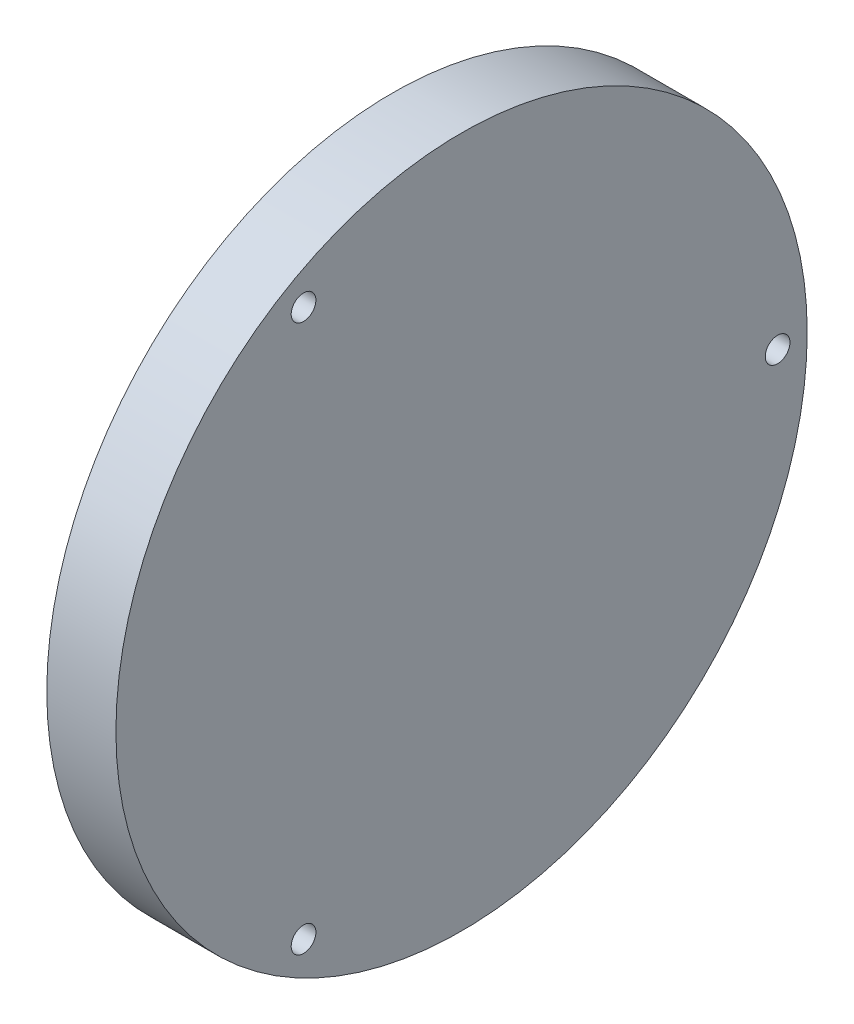
ISO-10303-21;
HEADER;
FILE_DESCRIPTION(('STEP AP214'),'2;1');
FILE_NAME('part.step','',(''),(''),'','','');
FILE_SCHEMA(('AUTOMOTIVE_DESIGN { 1 0 10303 214 1 1 1 1 }'));
ENDSEC;
DATA;
#1=APPLICATION_CONTEXT('core data for automotive mechanical design processes');
#2=APPLICATION_PROTOCOL_DEFINITION('international standard','automotive_design',2000,#1);
#3=PRODUCT_CONTEXT('',#1,'mechanical');
#4=PRODUCT('Part','Part','',(#3));
#5=PRODUCT_RELATED_PRODUCT_CATEGORY('part','',(#4));
#6=PRODUCT_DEFINITION_FORMATION('','',#4);
#7=PRODUCT_DEFINITION_CONTEXT('part definition',#1,'design');
#8=PRODUCT_DEFINITION('design','',#6,#7);
#9=PRODUCT_DEFINITION_SHAPE('','',#8);
#10=(LENGTH_UNIT() NAMED_UNIT(*) SI_UNIT(.MILLI.,.METRE.));
#11=(NAMED_UNIT(*) PLANE_ANGLE_UNIT() SI_UNIT($,.RADIAN.));
#12=(NAMED_UNIT(*) SI_UNIT($,.STERADIAN.) SOLID_ANGLE_UNIT());
#13=UNCERTAINTY_MEASURE_WITH_UNIT(LENGTH_MEASURE(1.E-05),#10,'distance_accuracy_value','');
#14=(GEOMETRIC_REPRESENTATION_CONTEXT(3) GLOBAL_UNCERTAINTY_ASSIGNED_CONTEXT((#13)) GLOBAL_UNIT_ASSIGNED_CONTEXT((#10,
#11,#12)) REPRESENTATION_CONTEXT('',''));
#15=CARTESIAN_POINT('',(0.,0.,0.));
#16=DIRECTION('',(0.,0.,1.));
#17=DIRECTION('',(1.,0.,0.));
#18=AXIS2_PLACEMENT_3D('',#15,#16,#17);
#19=CARTESIAN_POINT('',(0.,35.,0.));
#20=DIRECTION('',(1.,0.,0.));
#21=DIRECTION('',(0.,0.,-1.));
#22=AXIS2_PLACEMENT_3D('',#19,#20,#21);
#23=PLANE('',#22);
#24=CARTESIAN_POINT('',(0.,15.5884572681199,9.));
#25=DIRECTION('',(1.,0.,0.));
#26=DIRECTION('',(0.,0.,-1.));
#27=AXIS2_PLACEMENT_3D('',#24,#25,#26);
#28=CIRCLE('',#27,7.);
#29=CARTESIAN_POINT('',(0.,9.52627944162882,5.5));
#30=VERTEX_POINT('',#29);
#31=CARTESIAN_POINT('',(0.,21.650635094611,12.5));
#32=VERTEX_POINT('',#31);
#33=EDGE_CURVE('E48',#30,#32,#28,.T.);
#34=ORIENTED_EDGE('',*,*,#33,.T.);
#35=CARTESIAN_POINT('',(0.,0.,0.));
#36=DIRECTION('',(1.,0.,0.));
#37=DIRECTION('',(0.,0.,-1.));
#38=AXIS2_PLACEMENT_3D('',#35,#36,#37);
#39=CIRCLE('',#38,25.);
#40=CARTESIAN_POINT('',(0.,21.650635094611,-12.5));
#41=VERTEX_POINT('',#40);
#42=EDGE_CURVE('E103',#32,#41,#39,.T.);
#43=ORIENTED_EDGE('',*,*,#42,.T.);
#44=CARTESIAN_POINT('',(0.,15.5884572681199,-9.00000000000001));
#45=DIRECTION('',(1.,0.,0.));
#46=DIRECTION('',(0.,0.,-1.));
#47=AXIS2_PLACEMENT_3D('',#44,#45,#46);
#48=CIRCLE('',#47,7.);
#49=CARTESIAN_POINT('',(0.,9.52627944162882,-5.50000000000001));
#50=VERTEX_POINT('',#49);
#51=EDGE_CURVE('E93',#41,#50,#48,.T.);
#52=ORIENTED_EDGE('',*,*,#51,.T.);
#53=CARTESIAN_POINT('',(0.,0.,0.));
#54=DIRECTION('',(-1.,0.,0.));
#55=DIRECTION('',(0.,0.,1.));
#56=AXIS2_PLACEMENT_3D('',#53,#54,#55);
#57=CIRCLE('',#56,11.);
#58=EDGE_CURVE('E107',#50,#30,#57,.T.);
#59=ORIENTED_EDGE('',*,*,#58,.T.);
#60=EDGE_LOOP('',(#34,#43,#52,#59));
#61=FACE_BOUND('',#60,.T.);
#62=CARTESIAN_POINT('',(0.,0.,0.));
#63=DIRECTION('',(1.,0.,0.));
#64=DIRECTION('',(0.,0.,-1.));
#65=AXIS2_PLACEMENT_3D('',#62,#63,#64);
#66=CIRCLE('',#65,9.3);
#67=CARTESIAN_POINT('',(0.,0.,-9.3));
#68=VERTEX_POINT('',#67);
#69=EDGE_CURVE('E198',#68,#68,#66,.T.);
#70=ORIENTED_EDGE('',*,*,#69,.T.);
#71=EDGE_LOOP('',(#70));
#72=FACE_BOUND('',#71,.T.);
#73=CARTESIAN_POINT('',(0.,0.,0.));
#74=DIRECTION('',(1.,0.,0.));
#75=DIRECTION('',(0.,0.,-1.));
#76=AXIS2_PLACEMENT_3D('',#73,#74,#75);
#77=CIRCLE('',#76,26.7);
#78=CARTESIAN_POINT('',(0.,0.,-26.7));
#79=VERTEX_POINT('',#78);
#80=EDGE_CURVE('E191',#79,#79,#77,.T.);
#81=ORIENTED_EDGE('',*,*,#80,.F.);
#82=EDGE_LOOP('',(#81));
#83=FACE_BOUND('',#82,.T.);
#84=ADVANCED_FACE('F33',(#61,#72,#83),#23,.F.);
#85=CARTESIAN_POINT('',(3.,15.5884572681199,9.));
#86=DIRECTION('',(-1.,0.,0.));
#87=DIRECTION('',(0.,0.,1.));
#88=AXIS2_PLACEMENT_3D('',#85,#86,#87);
#89=CYLINDRICAL_SURFACE('',#88,7.);
#90=ORIENTED_EDGE('',*,*,#33,.F.);
#91=DIRECTION('',(-1.,0.,0.));
#92=VECTOR('',#91,1.);
#93=CARTESIAN_POINT('',(3.,9.52627944162882,5.5));
#94=LINE('',#93,#92);
#95=CARTESIAN_POINT('',(3.,9.52627944162882,5.5));
#96=VERTEX_POINT('',#95);
#97=EDGE_CURVE('E98',#96,#30,#94,.T.);
#98=ORIENTED_EDGE('',*,*,#97,.F.);
#99=CARTESIAN_POINT('',(3.,15.5884572681199,9.));
#100=DIRECTION('',(1.,0.,0.));
#101=DIRECTION('',(0.,0.,-1.));
#102=AXIS2_PLACEMENT_3D('',#99,#100,#101);
#103=CIRCLE('',#102,7.);
#104=CARTESIAN_POINT('',(3.,21.650635094611,12.5));
#105=VERTEX_POINT('',#104);
#106=EDGE_CURVE('E89',#96,#105,#103,.T.);
#107=ORIENTED_EDGE('',*,*,#106,.T.);
#108=DIRECTION('',(-1.,0.,0.));
#109=VECTOR('',#108,1.);
#110=CARTESIAN_POINT('',(3.,21.650635094611,12.5));
#111=LINE('',#110,#109);
#112=EDGE_CURVE('E87',#105,#32,#111,.T.);
#113=ORIENTED_EDGE('',*,*,#112,.T.);
#114=EDGE_LOOP('',(#90,#98,#107,#113));
#115=FACE_BOUND('',#114,.T.);
#116=ADVANCED_FACE('F135',(#115),#89,.F.);
#117=CARTESIAN_POINT('',(3.,0.,0.));
#118=DIRECTION('',(-1.,0.,0.));
#119=DIRECTION('',(0.,0.,1.));
#120=AXIS2_PLACEMENT_3D('',#117,#118,#119);
#121=CYLINDRICAL_SURFACE('',#120,25.);
#122=ORIENTED_EDGE('',*,*,#42,.F.);
#123=ORIENTED_EDGE('',*,*,#112,.F.);
#124=CARTESIAN_POINT('',(3.,0.,0.));
#125=DIRECTION('',(1.,0.,0.));
#126=DIRECTION('',(0.,0.,-1.));
#127=AXIS2_PLACEMENT_3D('',#124,#125,#126);
#128=CIRCLE('',#127,25.);
#129=CARTESIAN_POINT('',(3.,21.650635094611,-12.5));
#130=VERTEX_POINT('',#129);
#131=EDGE_CURVE('E80',#105,#130,#128,.T.);
#132=ORIENTED_EDGE('',*,*,#131,.T.);
#133=DIRECTION('',(-1.,0.,0.));
#134=VECTOR('',#133,1.);
#135=CARTESIAN_POINT('',(3.,21.650635094611,-12.5));
#136=LINE('',#135,#134);
#137=EDGE_CURVE('E86',#130,#41,#136,.T.);
#138=ORIENTED_EDGE('',*,*,#137,.T.);
#139=EDGE_LOOP('',(#122,#123,#132,#138));
#140=FACE_BOUND('',#139,.T.);
#141=ADVANCED_FACE('F85',(#140),#121,.F.);
#142=CARTESIAN_POINT('',(3.,15.5884572681199,-9.00000000000001));
#143=DIRECTION('',(-1.,0.,0.));
#144=DIRECTION('',(0.,0.,1.));
#145=AXIS2_PLACEMENT_3D('',#142,#143,#144);
#146=CYLINDRICAL_SURFACE('',#145,7.);
#147=ORIENTED_EDGE('',*,*,#51,.F.);
#148=ORIENTED_EDGE('',*,*,#137,.F.);
#149=CARTESIAN_POINT('',(3.,15.5884572681199,-9.00000000000001));
#150=DIRECTION('',(1.,0.,0.));
#151=DIRECTION('',(0.,0.,-1.));
#152=AXIS2_PLACEMENT_3D('',#149,#150,#151);
#153=CIRCLE('',#152,7.);
#154=CARTESIAN_POINT('',(3.,9.52627944162882,-5.50000000000001));
#155=VERTEX_POINT('',#154);
#156=EDGE_CURVE('E88',#130,#155,#153,.T.);
#157=ORIENTED_EDGE('',*,*,#156,.T.);
#158=DIRECTION('',(-1.,0.,0.));
#159=VECTOR('',#158,1.);
#160=CARTESIAN_POINT('',(3.,9.52627944162882,-5.50000000000001));
#161=LINE('',#160,#159);
#162=EDGE_CURVE('E72',#155,#50,#161,.T.);
#163=ORIENTED_EDGE('',*,*,#162,.T.);
#164=EDGE_LOOP('',(#147,#148,#157,#163));
#165=FACE_BOUND('',#164,.T.);
#166=ADVANCED_FACE('F91',(#165),#146,.F.);
#167=CARTESIAN_POINT('',(3.,0.,0.));
#168=DIRECTION('',(-1.,0.,0.));
#169=DIRECTION('',(0.,0.,1.));
#170=AXIS2_PLACEMENT_3D('',#167,#168,#169);
#171=CYLINDRICAL_SURFACE('',#170,11.);
#172=ORIENTED_EDGE('',*,*,#58,.F.);
#173=ORIENTED_EDGE('',*,*,#162,.F.);
#174=CARTESIAN_POINT('',(3.,0.,0.));
#175=DIRECTION('',(-1.,0.,0.));
#176=DIRECTION('',(0.,0.,1.));
#177=AXIS2_PLACEMENT_3D('',#174,#175,#176);
#178=CIRCLE('',#177,11.);
#179=EDGE_CURVE('E56',#155,#96,#178,.T.);
#180=ORIENTED_EDGE('',*,*,#179,.T.);
#181=ORIENTED_EDGE('',*,*,#97,.T.);
#182=EDGE_LOOP('',(#172,#173,#180,#181));
#183=FACE_BOUND('',#182,.T.);
#184=ADVANCED_FACE('F204',(#183),#171,.T.);
#185=CARTESIAN_POINT('',(3.,7.79422863405995,4.5));
#186=DIRECTION('',(1.,0.,0.));
#187=DIRECTION('',(0.,0.,-1.));
#188=AXIS2_PLACEMENT_3D('',#185,#186,#187);
#189=PLANE('',#188);
#190=ORIENTED_EDGE('',*,*,#106,.F.);
#191=ORIENTED_EDGE('',*,*,#179,.F.);
#192=ORIENTED_EDGE('',*,*,#156,.F.);
#193=ORIENTED_EDGE('',*,*,#131,.F.);
#194=EDGE_LOOP('',(#190,#191,#192,#193));
#195=FACE_BOUND('',#194,.T.);
#196=ADVANCED_FACE('F96',(#195),#189,.F.);
#197=CARTESIAN_POINT('',(1.5,0.,0.));
#198=DIRECTION('',(1.,0.,0.));
#199=DIRECTION('',(0.,0.,-1.));
#200=AXIS2_PLACEMENT_3D('',#197,#198,#199);
#201=PLANE('',#200);
#202=CARTESIAN_POINT('',(1.5,0.,0.));
#203=DIRECTION('',(1.,0.,0.));
#204=DIRECTION('',(0.,0.,-1.));
#205=AXIS2_PLACEMENT_3D('',#202,#203,#204);
#206=CIRCLE('',#205,9.3);
#207=CARTESIAN_POINT('',(1.5,0.,-9.3));
#208=VERTEX_POINT('',#207);
#209=EDGE_CURVE('E104',#208,#208,#206,.T.);
#210=ORIENTED_EDGE('',*,*,#209,.F.);
#211=EDGE_LOOP('',(#210));
#212=FACE_BOUND('',#211,.T.);
#213=CARTESIAN_POINT('',(1.5,0.,0.));
#214=DIRECTION('',(1.,0.,0.));
#215=DIRECTION('',(0.,0.,-1.));
#216=AXIS2_PLACEMENT_3D('',#213,#214,#215);
#217=CIRCLE('',#216,6.7);
#218=CARTESIAN_POINT('',(1.5,0.,-6.7));
#219=VERTEX_POINT('',#218);
#220=EDGE_CURVE('E195',#219,#219,#217,.T.);
#221=ORIENTED_EDGE('',*,*,#220,.T.);
#222=EDGE_LOOP('',(#221));
#223=FACE_BOUND('',#222,.T.);
#224=ADVANCED_FACE('F211',(#212,#223),#201,.F.);
#225=CARTESIAN_POINT('',(1.5,0.,0.));
#226=DIRECTION('',(-1.,0.,0.));
#227=DIRECTION('',(0.,0.,1.));
#228=AXIS2_PLACEMENT_3D('',#225,#226,#227);
#229=CYLINDRICAL_SURFACE('',#228,9.3);
#230=ORIENTED_EDGE('',*,*,#209,.T.);
#231=EDGE_LOOP('',(#230));
#232=FACE_BOUND('',#231,.T.);
#233=ORIENTED_EDGE('',*,*,#69,.F.);
#234=EDGE_LOOP('',(#233));
#235=FACE_BOUND('',#234,.T.);
#236=ADVANCED_FACE('F245',(#232,#235),#229,.F.);
#237=CARTESIAN_POINT('',(1.5,0.,0.));
#238=DIRECTION('',(-1.,0.,0.));
#239=DIRECTION('',(0.,0.,1.));
#240=AXIS2_PLACEMENT_3D('',#237,#238,#239);
#241=CYLINDRICAL_SURFACE('',#240,6.7);
#242=ORIENTED_EDGE('',*,*,#220,.F.);
#243=EDGE_LOOP('',(#242));
#244=FACE_BOUND('',#243,.T.);
#245=CARTESIAN_POINT('',(0.,0.,0.));
#246=DIRECTION('',(1.,0.,0.));
#247=DIRECTION('',(0.,0.,-1.));
#248=AXIS2_PLACEMENT_3D('',#245,#246,#247);
#249=CIRCLE('',#248,6.7);
#250=CARTESIAN_POINT('',(0.,0.,-6.7));
#251=VERTEX_POINT('',#250);
#252=EDGE_CURVE('E188',#251,#251,#249,.T.);
#253=ORIENTED_EDGE('',*,*,#252,.T.);
#254=EDGE_LOOP('',(#253));
#255=FACE_BOUND('',#254,.T.);
#256=ADVANCED_FACE('F145',(#244,#255),#241,.T.);
#257=ORIENTED_EDGE('',*,*,#252,.F.);
#258=EDGE_LOOP('',(#257));
#259=FACE_BOUND('',#258,.T.);
#260=ADVANCED_FACE('F137',(#259),#23,.F.);
#261=CARTESIAN_POINT('',(1.5,0.,0.));
#262=DIRECTION('',(1.,0.,0.));
#263=DIRECTION('',(0.,0.,-1.));
#264=AXIS2_PLACEMENT_3D('',#261,#262,#263);
#265=PLANE('',#264);
#266=CARTESIAN_POINT('',(1.5,0.,0.));
#267=DIRECTION('',(1.,0.,0.));
#268=DIRECTION('',(0.,0.,-1.));
#269=AXIS2_PLACEMENT_3D('',#266,#267,#268);
#270=CIRCLE('',#269,29.3);
#271=CARTESIAN_POINT('',(1.5,0.,-29.3));
#272=VERTEX_POINT('',#271);
#273=EDGE_CURVE('E184',#272,#272,#270,.T.);
#274=ORIENTED_EDGE('',*,*,#273,.F.);
#275=EDGE_LOOP('',(#274));
#276=FACE_BOUND('',#275,.T.);
#277=CARTESIAN_POINT('',(1.5,0.,0.));
#278=DIRECTION('',(1.,0.,0.));
#279=DIRECTION('',(0.,0.,-1.));
#280=AXIS2_PLACEMENT_3D('',#277,#278,#279);
#281=CIRCLE('',#280,26.7);
#282=CARTESIAN_POINT('',(1.5,0.,-26.7));
#283=VERTEX_POINT('',#282);
#284=EDGE_CURVE('E185',#283,#283,#281,.T.);
#285=ORIENTED_EDGE('',*,*,#284,.T.);
#286=EDGE_LOOP('',(#285));
#287=FACE_BOUND('',#286,.T.);
#288=ADVANCED_FACE('F144',(#276,#287),#265,.F.);
#289=CARTESIAN_POINT('',(1.5,0.,0.));
#290=DIRECTION('',(-1.,0.,0.));
#291=DIRECTION('',(0.,0.,1.));
#292=AXIS2_PLACEMENT_3D('',#289,#290,#291);
#293=CYLINDRICAL_SURFACE('',#292,29.3);
#294=ORIENTED_EDGE('',*,*,#273,.T.);
#295=EDGE_LOOP('',(#294));
#296=FACE_BOUND('',#295,.T.);
#297=CARTESIAN_POINT('',(0.,0.,0.));
#298=DIRECTION('',(1.,0.,0.));
#299=DIRECTION('',(0.,0.,-1.));
#300=AXIS2_PLACEMENT_3D('',#297,#298,#299);
#301=CIRCLE('',#300,29.3);
#302=CARTESIAN_POINT('',(0.,0.,-29.3));
#303=VERTEX_POINT('',#302);
#304=EDGE_CURVE('E182',#303,#303,#301,.T.);
#305=ORIENTED_EDGE('',*,*,#304,.F.);
#306=EDGE_LOOP('',(#305));
#307=FACE_BOUND('',#306,.T.);
#308=ADVANCED_FACE('F129',(#296,#307),#293,.F.);
#309=CARTESIAN_POINT('',(1.5,0.,0.));
#310=DIRECTION('',(-1.,0.,0.));
#311=DIRECTION('',(0.,0.,1.));
#312=AXIS2_PLACEMENT_3D('',#309,#310,#311);
#313=CYLINDRICAL_SURFACE('',#312,26.7);
#314=ORIENTED_EDGE('',*,*,#284,.F.);
#315=EDGE_LOOP('',(#314));
#316=FACE_BOUND('',#315,.T.);
#317=ORIENTED_EDGE('',*,*,#80,.T.);
#318=EDGE_LOOP('',(#317));
#319=FACE_BOUND('',#318,.T.);
#320=ADVANCED_FACE('F124',(#316,#319),#313,.T.);
#321=CARTESIAN_POINT('',(7.,0.,0.));
#322=DIRECTION('',(-1.,0.,0.));
#323=DIRECTION('',(0.,0.,1.));
#324=AXIS2_PLACEMENT_3D('',#321,#322,#323);
#325=PLANE('',#324);
#326=CARTESIAN_POINT('',(7.,27.712812921102,16.));
#327=DIRECTION('',(1.,0.,0.));
#328=DIRECTION('',(0.,0.,-1.));
#329=AXIS2_PLACEMENT_3D('',#326,#327,#328);
#330=CIRCLE('',#329,1.25);
#331=CARTESIAN_POINT('',(7.,27.712812921102,14.75));
#332=VERTEX_POINT('',#331);
#333=EDGE_CURVE('E489',#332,#332,#330,.T.);
#334=ORIENTED_EDGE('',*,*,#333,.F.);
#335=EDGE_LOOP('',(#334));
#336=FACE_BOUND('',#335,.T.);
#337=CARTESIAN_POINT('',(7.,-27.712812921102,16.));
#338=DIRECTION('',(1.,0.,0.));
#339=DIRECTION('',(0.,0.,-1.));
#340=AXIS2_PLACEMENT_3D('',#337,#338,#339);
#341=CIRCLE('',#340,1.25);
#342=CARTESIAN_POINT('',(7.,-27.712812921102,14.75));
#343=VERTEX_POINT('',#342);
#344=EDGE_CURVE('E490',#343,#343,#341,.T.);
#345=ORIENTED_EDGE('',*,*,#344,.F.);
#346=EDGE_LOOP('',(#345));
#347=FACE_BOUND('',#346,.T.);
#348=CARTESIAN_POINT('',(7.,0.,-32.));
#349=DIRECTION('',(1.,0.,0.));
#350=DIRECTION('',(0.,0.,-1.));
#351=AXIS2_PLACEMENT_3D('',#348,#349,#350);
#352=CIRCLE('',#351,1.25);
#353=CARTESIAN_POINT('',(7.,0.,-33.25));
#354=VERTEX_POINT('',#353);
#355=EDGE_CURVE('E500',#354,#354,#352,.T.);
#356=ORIENTED_EDGE('',*,*,#355,.F.);
#357=EDGE_LOOP('',(#356));
#358=FACE_BOUND('',#357,.T.);
#359=CARTESIAN_POINT('',(7.,0.,0.));
#360=DIRECTION('',(-1.,0.,0.));
#361=DIRECTION('',(0.,0.,1.));
#362=AXIS2_PLACEMENT_3D('',#359,#360,#361);
#363=CIRCLE('',#362,35.);
#364=CARTESIAN_POINT('',(7.,0.,35.));
#365=VERTEX_POINT('',#364);
#366=EDGE_CURVE('E11',#365,#365,#363,.T.);
#367=ORIENTED_EDGE('',*,*,#366,.F.);
#368=EDGE_LOOP('',(#367));
#369=FACE_BOUND('',#368,.T.);
#370=ADVANCED_FACE('F119',(#336,#347,#358,#369),#325,.F.);
#371=CARTESIAN_POINT('',(-10.,0.,0.));
#372=DIRECTION('',(-1.,0.,0.));
#373=DIRECTION('',(0.,0.,1.));
#374=AXIS2_PLACEMENT_3D('',#371,#372,#373);
#375=CYLINDRICAL_SURFACE('',#374,35.);
#376=CARTESIAN_POINT('',(0.,0.,0.));
#377=DIRECTION('',(-1.,0.,0.));
#378=DIRECTION('',(0.,0.,1.));
#379=AXIS2_PLACEMENT_3D('',#376,#377,#378);
#380=CIRCLE('',#379,35.);
#381=CARTESIAN_POINT('',(0.,0.,35.));
#382=VERTEX_POINT('',#381);
#383=EDGE_CURVE('E41',#382,#382,#380,.T.);
#384=ORIENTED_EDGE('',*,*,#383,.F.);
#385=EDGE_LOOP('',(#384));
#386=FACE_BOUND('',#385,.T.);
#387=ORIENTED_EDGE('',*,*,#366,.T.);
#388=EDGE_LOOP('',(#387));
#389=FACE_BOUND('',#388,.T.);
#390=ADVANCED_FACE('F116',(#386,#389),#375,.T.);
#391=CARTESIAN_POINT('',(0.,32.,0.));
#392=DIRECTION('',(1.,0.,0.));
#393=DIRECTION('',(0.,0.,-1.));
#394=AXIS2_PLACEMENT_3D('',#391,#392,#393);
#395=CIRCLE('',#394,1.25);
#396=CARTESIAN_POINT('',(0.,32.,-1.25));
#397=VERTEX_POINT('',#396);
#398=EDGE_CURVE('E159',#397,#397,#395,.T.);
#399=ORIENTED_EDGE('',*,*,#398,.T.);
#400=EDGE_LOOP('',(#399));
#401=FACE_BOUND('',#400,.T.);
#402=CARTESIAN_POINT('',(0.,16.,-27.712812921102));
#403=DIRECTION('',(1.,0.,0.));
#404=DIRECTION('',(0.,0.,-1.));
#405=AXIS2_PLACEMENT_3D('',#402,#403,#404);
#406=CIRCLE('',#405,1.25);
#407=CARTESIAN_POINT('',(0.,16.,-28.962812921102));
#408=VERTEX_POINT('',#407);
#409=EDGE_CURVE('E163',#408,#408,#406,.T.);
#410=ORIENTED_EDGE('',*,*,#409,.T.);
#411=EDGE_LOOP('',(#410));
#412=FACE_BOUND('',#411,.T.);
#413=CARTESIAN_POINT('',(0.,-16.,-27.712812921102));
#414=DIRECTION('',(1.,0.,0.));
#415=DIRECTION('',(0.,0.,-1.));
#416=AXIS2_PLACEMENT_3D('',#413,#414,#415);
#417=CIRCLE('',#416,1.25);
#418=CARTESIAN_POINT('',(0.,-16.,-28.962812921102));
#419=VERTEX_POINT('',#418);
#420=EDGE_CURVE('E167',#419,#419,#417,.T.);
#421=ORIENTED_EDGE('',*,*,#420,.T.);
#422=EDGE_LOOP('',(#421));
#423=FACE_BOUND('',#422,.T.);
#424=CARTESIAN_POINT('',(0.,-32.,0.));
#425=DIRECTION('',(1.,0.,0.));
#426=DIRECTION('',(0.,0.,-1.));
#427=AXIS2_PLACEMENT_3D('',#424,#425,#426);
#428=CIRCLE('',#427,1.25);
#429=CARTESIAN_POINT('',(0.,-32.,-1.25));
#430=VERTEX_POINT('',#429);
#431=EDGE_CURVE('E171',#430,#430,#428,.T.);
#432=ORIENTED_EDGE('',*,*,#431,.T.);
#433=EDGE_LOOP('',(#432));
#434=FACE_BOUND('',#433,.T.);
#435=CARTESIAN_POINT('',(0.,-16.,27.712812921102));
#436=DIRECTION('',(1.,0.,0.));
#437=DIRECTION('',(0.,0.,-1.));
#438=AXIS2_PLACEMENT_3D('',#435,#436,#437);
#439=CIRCLE('',#438,1.25);
#440=CARTESIAN_POINT('',(0.,-16.,26.462812921102));
#441=VERTEX_POINT('',#440);
#442=EDGE_CURVE('E175',#441,#441,#439,.T.);
#443=ORIENTED_EDGE('',*,*,#442,.T.);
#444=EDGE_LOOP('',(#443));
#445=FACE_BOUND('',#444,.T.);
#446=CARTESIAN_POINT('',(0.,16.,27.712812921102));
#447=DIRECTION('',(1.,0.,0.));
#448=DIRECTION('',(0.,0.,-1.));
#449=AXIS2_PLACEMENT_3D('',#446,#447,#448);
#450=CIRCLE('',#449,1.25);
#451=CARTESIAN_POINT('',(0.,16.,26.462812921102));
#452=VERTEX_POINT('',#451);
#453=EDGE_CURVE('E179',#452,#452,#450,.T.);
#454=ORIENTED_EDGE('',*,*,#453,.T.);
#455=EDGE_LOOP('',(#454));
#456=FACE_BOUND('',#455,.T.);
#457=ORIENTED_EDGE('',*,*,#304,.T.);
#458=EDGE_LOOP('',(#457));
#459=FACE_BOUND('',#458,.T.);
#460=ORIENTED_EDGE('',*,*,#383,.T.);
#461=EDGE_LOOP('',(#460));
#462=FACE_BOUND('',#461,.T.);
#463=ADVANCED_FACE('F35',(#401,#412,#423,#434,#445,#456,#459,#462),#23,.F.);
#464=CARTESIAN_POINT('',(4.,16.,27.712812921102));
#465=DIRECTION('',(-1.,0.,0.));
#466=DIRECTION('',(0.,0.,1.));
#467=AXIS2_PLACEMENT_3D('',#464,#465,#466);
#468=CYLINDRICAL_SURFACE('',#467,1.25);
#469=CARTESIAN_POINT('',(4.,16.,27.712812921102));
#470=DIRECTION('',(1.,0.,0.));
#471=DIRECTION('',(0.,0.,-1.));
#472=AXIS2_PLACEMENT_3D('',#469,#470,#471);
#473=CIRCLE('',#472,1.25);
#474=CARTESIAN_POINT('',(4.,16.,26.462812921102));
#475=VERTEX_POINT('',#474);
#476=EDGE_CURVE('E510',#475,#475,#473,.T.);
#477=ORIENTED_EDGE('',*,*,#476,.T.);
#478=EDGE_LOOP('',(#477));
#479=FACE_BOUND('',#478,.T.);
#480=ORIENTED_EDGE('',*,*,#453,.F.);
#481=EDGE_LOOP('',(#480));
#482=FACE_BOUND('',#481,.T.);
#483=ADVANCED_FACE('F148',(#479,#482),#468,.F.);
#484=CARTESIAN_POINT('',(4.,16.,27.712812921102));
#485=DIRECTION('',(1.,0.,0.));
#486=DIRECTION('',(0.,0.,-1.));
#487=AXIS2_PLACEMENT_3D('',#484,#485,#486);
#488=PLANE('',#487);
#489=ORIENTED_EDGE('',*,*,#476,.F.);
#490=EDGE_LOOP('',(#489));
#491=FACE_BOUND('',#490,.T.);
#492=ADVANCED_FACE('F153',(#491),#488,.F.);
#493=CARTESIAN_POINT('',(4.,-16.,27.712812921102));
#494=DIRECTION('',(-1.,0.,0.));
#495=DIRECTION('',(0.,0.,1.));
#496=AXIS2_PLACEMENT_3D('',#493,#494,#495);
#497=CYLINDRICAL_SURFACE('',#496,1.25);
#498=CARTESIAN_POINT('',(4.,-16.,27.712812921102));
#499=DIRECTION('',(1.,0.,0.));
#500=DIRECTION('',(0.,0.,-1.));
#501=AXIS2_PLACEMENT_3D('',#498,#499,#500);
#502=CIRCLE('',#501,1.25);
#503=CARTESIAN_POINT('',(4.,-16.,26.462812921102));
#504=VERTEX_POINT('',#503);
#505=EDGE_CURVE('E518',#504,#504,#502,.T.);
#506=ORIENTED_EDGE('',*,*,#505,.T.);
#507=EDGE_LOOP('',(#506));
#508=FACE_BOUND('',#507,.T.);
#509=ORIENTED_EDGE('',*,*,#442,.F.);
#510=EDGE_LOOP('',(#509));
#511=FACE_BOUND('',#510,.T.);
#512=ADVANCED_FACE('F317',(#508,#511),#497,.F.);
#513=CARTESIAN_POINT('',(4.,-16.,27.712812921102));
#514=DIRECTION('',(1.,0.,0.));
#515=DIRECTION('',(0.,0.,-1.));
#516=AXIS2_PLACEMENT_3D('',#513,#514,#515);
#517=PLANE('',#516);
#518=ORIENTED_EDGE('',*,*,#505,.F.);
#519=EDGE_LOOP('',(#518));
#520=FACE_BOUND('',#519,.T.);
#521=ADVANCED_FACE('F327',(#520),#517,.F.);
#522=CARTESIAN_POINT('',(4.,-32.,0.));
#523=DIRECTION('',(-1.,0.,0.));
#524=DIRECTION('',(0.,0.,1.));
#525=AXIS2_PLACEMENT_3D('',#522,#523,#524);
#526=CYLINDRICAL_SURFACE('',#525,1.25);
#527=CARTESIAN_POINT('',(4.,-32.,0.));
#528=DIRECTION('',(1.,0.,0.));
#529=DIRECTION('',(0.,0.,-1.));
#530=AXIS2_PLACEMENT_3D('',#527,#528,#529);
#531=CIRCLE('',#530,1.25);
#532=CARTESIAN_POINT('',(4.,-32.,-1.25));
#533=VERTEX_POINT('',#532);
#534=EDGE_CURVE('E522',#533,#533,#531,.T.);
#535=ORIENTED_EDGE('',*,*,#534,.T.);
#536=EDGE_LOOP('',(#535));
#537=FACE_BOUND('',#536,.T.);
#538=ORIENTED_EDGE('',*,*,#431,.F.);
#539=EDGE_LOOP('',(#538));
#540=FACE_BOUND('',#539,.T.);
#541=ADVANCED_FACE('F337',(#537,#540),#526,.F.);
#542=CARTESIAN_POINT('',(4.,-32.,0.));
#543=DIRECTION('',(1.,0.,0.));
#544=DIRECTION('',(0.,0.,-1.));
#545=AXIS2_PLACEMENT_3D('',#542,#543,#544);
#546=PLANE('',#545);
#547=ORIENTED_EDGE('',*,*,#534,.F.);
#548=EDGE_LOOP('',(#547));
#549=FACE_BOUND('',#548,.T.);
#550=ADVANCED_FACE('F347',(#549),#546,.F.);
#551=CARTESIAN_POINT('',(4.,-16.,-27.712812921102));
#552=DIRECTION('',(-1.,0.,0.));
#553=DIRECTION('',(0.,0.,1.));
#554=AXIS2_PLACEMENT_3D('',#551,#552,#553);
#555=CYLINDRICAL_SURFACE('',#554,1.25);
#556=CARTESIAN_POINT('',(4.,-16.,-27.712812921102));
#557=DIRECTION('',(1.,0.,0.));
#558=DIRECTION('',(0.,0.,-1.));
#559=AXIS2_PLACEMENT_3D('',#556,#557,#558);
#560=CIRCLE('',#559,1.25);
#561=CARTESIAN_POINT('',(4.,-16.,-28.962812921102));
#562=VERTEX_POINT('',#561);
#563=EDGE_CURVE('E526',#562,#562,#560,.T.);
#564=ORIENTED_EDGE('',*,*,#563,.T.);
#565=EDGE_LOOP('',(#564));
#566=FACE_BOUND('',#565,.T.);
#567=ORIENTED_EDGE('',*,*,#420,.F.);
#568=EDGE_LOOP('',(#567));
#569=FACE_BOUND('',#568,.T.);
#570=ADVANCED_FACE('F357',(#566,#569),#555,.F.);
#571=CARTESIAN_POINT('',(4.,-16.,-27.712812921102));
#572=DIRECTION('',(1.,0.,0.));
#573=DIRECTION('',(0.,0.,-1.));
#574=AXIS2_PLACEMENT_3D('',#571,#572,#573);
#575=PLANE('',#574);
#576=ORIENTED_EDGE('',*,*,#563,.F.);
#577=EDGE_LOOP('',(#576));
#578=FACE_BOUND('',#577,.T.);
#579=ADVANCED_FACE('F367',(#578),#575,.F.);
#580=CARTESIAN_POINT('',(4.,16.,-27.712812921102));
#581=DIRECTION('',(-1.,0.,0.));
#582=DIRECTION('',(0.,0.,1.));
#583=AXIS2_PLACEMENT_3D('',#580,#581,#582);
#584=CYLINDRICAL_SURFACE('',#583,1.25);
#585=CARTESIAN_POINT('',(4.,16.,-27.712812921102));
#586=DIRECTION('',(1.,0.,0.));
#587=DIRECTION('',(0.,0.,-1.));
#588=AXIS2_PLACEMENT_3D('',#585,#586,#587);
#589=CIRCLE('',#588,1.25);
#590=CARTESIAN_POINT('',(4.,16.,-28.962812921102));
#591=VERTEX_POINT('',#590);
#592=EDGE_CURVE('E511',#591,#591,#589,.T.);
#593=ORIENTED_EDGE('',*,*,#592,.T.);
#594=EDGE_LOOP('',(#593));
#595=FACE_BOUND('',#594,.T.);
#596=ORIENTED_EDGE('',*,*,#409,.F.);
#597=EDGE_LOOP('',(#596));
#598=FACE_BOUND('',#597,.T.);
#599=ADVANCED_FACE('F377',(#595,#598),#584,.F.);
#600=CARTESIAN_POINT('',(4.,16.,-27.712812921102));
#601=DIRECTION('',(1.,0.,0.));
#602=DIRECTION('',(0.,0.,-1.));
#603=AXIS2_PLACEMENT_3D('',#600,#601,#602);
#604=PLANE('',#603);
#605=ORIENTED_EDGE('',*,*,#592,.F.);
#606=EDGE_LOOP('',(#605));
#607=FACE_BOUND('',#606,.T.);
#608=ADVANCED_FACE('F387',(#607),#604,.F.);
#609=CARTESIAN_POINT('',(4.,32.,0.));
#610=DIRECTION('',(-1.,0.,0.));
#611=DIRECTION('',(0.,0.,1.));
#612=AXIS2_PLACEMENT_3D('',#609,#610,#611);
#613=CYLINDRICAL_SURFACE('',#612,1.25);
#614=CARTESIAN_POINT('',(4.,32.,0.));
#615=DIRECTION('',(1.,0.,0.));
#616=DIRECTION('',(0.,0.,-1.));
#617=AXIS2_PLACEMENT_3D('',#614,#615,#616);
#618=CIRCLE('',#617,1.25);
#619=CARTESIAN_POINT('',(4.,32.,-1.25));
#620=VERTEX_POINT('',#619);
#621=EDGE_CURVE('E506',#620,#620,#618,.T.);
#622=ORIENTED_EDGE('',*,*,#621,.T.);
#623=EDGE_LOOP('',(#622));
#624=FACE_BOUND('',#623,.T.);
#625=ORIENTED_EDGE('',*,*,#398,.F.);
#626=EDGE_LOOP('',(#625));
#627=FACE_BOUND('',#626,.T.);
#628=ADVANCED_FACE('F397',(#624,#627),#613,.F.);
#629=CARTESIAN_POINT('',(4.,32.,0.));
#630=DIRECTION('',(1.,0.,0.));
#631=DIRECTION('',(0.,0.,-1.));
#632=AXIS2_PLACEMENT_3D('',#629,#630,#631);
#633=PLANE('',#632);
#634=ORIENTED_EDGE('',*,*,#621,.F.);
#635=EDGE_LOOP('',(#634));
#636=FACE_BOUND('',#635,.T.);
#637=ADVANCED_FACE('F407',(#636),#633,.F.);
#638=CARTESIAN_POINT('',(7.,0.,-32.));
#639=DIRECTION('',(-1.,0.,0.));
#640=DIRECTION('',(0.,0.,1.));
#641=AXIS2_PLACEMENT_3D('',#638,#639,#640);
#642=CYLINDRICAL_SURFACE('',#641,1.25);
#643=ORIENTED_EDGE('',*,*,#355,.T.);
#644=EDGE_LOOP('',(#643));
#645=FACE_BOUND('',#644,.T.);
#646=CARTESIAN_POINT('',(4.,0.,-32.));
#647=DIRECTION('',(1.,0.,0.));
#648=DIRECTION('',(0.,0.,-1.));
#649=AXIS2_PLACEMENT_3D('',#646,#647,#648);
#650=CIRCLE('',#649,1.25);
#651=CARTESIAN_POINT('',(4.,0.,-33.25));
#652=VERTEX_POINT('',#651);
#653=EDGE_CURVE('E503',#652,#652,#650,.T.);
#654=ORIENTED_EDGE('',*,*,#653,.F.);
#655=EDGE_LOOP('',(#654));
#656=FACE_BOUND('',#655,.T.);
#657=ADVANCED_FACE('F416',(#645,#656),#642,.F.);
#658=CARTESIAN_POINT('',(4.,0.,-32.));
#659=DIRECTION('',(1.,0.,0.));
#660=DIRECTION('',(0.,0.,-1.));
#661=AXIS2_PLACEMENT_3D('',#658,#659,#660);
#662=PLANE('',#661);
#663=ORIENTED_EDGE('',*,*,#653,.T.);
#664=EDGE_LOOP('',(#663));
#665=FACE_BOUND('',#664,.T.);
#666=ADVANCED_FACE('F431',(#665),#662,.T.);
#667=CARTESIAN_POINT('',(7.,-27.712812921102,16.));
#668=DIRECTION('',(-1.,0.,0.));
#669=DIRECTION('',(0.,0.,1.));
#670=AXIS2_PLACEMENT_3D('',#667,#668,#669);
#671=CYLINDRICAL_SURFACE('',#670,1.25);
#672=ORIENTED_EDGE('',*,*,#344,.T.);
#673=EDGE_LOOP('',(#672));
#674=FACE_BOUND('',#673,.T.);
#675=CARTESIAN_POINT('',(4.,-27.712812921102,16.));
#676=DIRECTION('',(1.,0.,0.));
#677=DIRECTION('',(0.,0.,-1.));
#678=AXIS2_PLACEMENT_3D('',#675,#676,#677);
#679=CIRCLE('',#678,1.25);
#680=CARTESIAN_POINT('',(4.,-27.712812921102,14.75));
#681=VERTEX_POINT('',#680);
#682=EDGE_CURVE('E495',#681,#681,#679,.T.);
#683=ORIENTED_EDGE('',*,*,#682,.F.);
#684=EDGE_LOOP('',(#683));
#685=FACE_BOUND('',#684,.T.);
#686=ADVANCED_FACE('F441',(#674,#685),#671,.F.);
#687=CARTESIAN_POINT('',(4.,-27.712812921102,16.));
#688=DIRECTION('',(1.,0.,0.));
#689=DIRECTION('',(0.,0.,-1.));
#690=AXIS2_PLACEMENT_3D('',#687,#688,#689);
#691=PLANE('',#690);
#692=ORIENTED_EDGE('',*,*,#682,.T.);
#693=EDGE_LOOP('',(#692));
#694=FACE_BOUND('',#693,.T.);
#695=ADVANCED_FACE('F451',(#694),#691,.T.);
#696=CARTESIAN_POINT('',(7.,27.712812921102,16.));
#697=DIRECTION('',(-1.,0.,0.));
#698=DIRECTION('',(0.,0.,1.));
#699=AXIS2_PLACEMENT_3D('',#696,#697,#698);
#700=CYLINDRICAL_SURFACE('',#699,1.25);
#701=ORIENTED_EDGE('',*,*,#333,.T.);
#702=EDGE_LOOP('',(#701));
#703=FACE_BOUND('',#702,.T.);
#704=CARTESIAN_POINT('',(4.,27.712812921102,16.));
#705=DIRECTION('',(1.,0.,0.));
#706=DIRECTION('',(0.,0.,-1.));
#707=AXIS2_PLACEMENT_3D('',#704,#705,#706);
#708=CIRCLE('',#707,1.25);
#709=CARTESIAN_POINT('',(4.,27.712812921102,14.75));
#710=VERTEX_POINT('',#709);
#711=EDGE_CURVE('E487',#710,#710,#708,.T.);
#712=ORIENTED_EDGE('',*,*,#711,.F.);
#713=EDGE_LOOP('',(#712));
#714=FACE_BOUND('',#713,.T.);
#715=ADVANCED_FACE('F461',(#703,#714),#700,.F.);
#716=CARTESIAN_POINT('',(4.,27.712812921102,16.));
#717=DIRECTION('',(1.,0.,0.));
#718=DIRECTION('',(0.,0.,-1.));
#719=AXIS2_PLACEMENT_3D('',#716,#717,#718);
#720=PLANE('',#719);
#721=ORIENTED_EDGE('',*,*,#711,.T.);
#722=EDGE_LOOP('',(#721));
#723=FACE_BOUND('',#722,.T.);
#724=ADVANCED_FACE('F471',(#723),#720,.T.);
#725=CLOSED_SHELL('',(#84,#116,#141,#166,#184,#196,#224,#236,#256,#260,#288,#308,#320,#370,#390,
#463,#483,#492,#512,#521,#541,#550,#570,#579,#599,#608,#628,#637,#657,#666,#686,#695,#715,#724));
#726=MANIFOLD_SOLID_BREP('B2',#725);
#727=ADVANCED_BREP_SHAPE_REPRESENTATION('',(#18,#726),#14);
#728=SHAPE_DEFINITION_REPRESENTATION(#9,#727);
ENDSEC;
END-ISO-10303-21;
